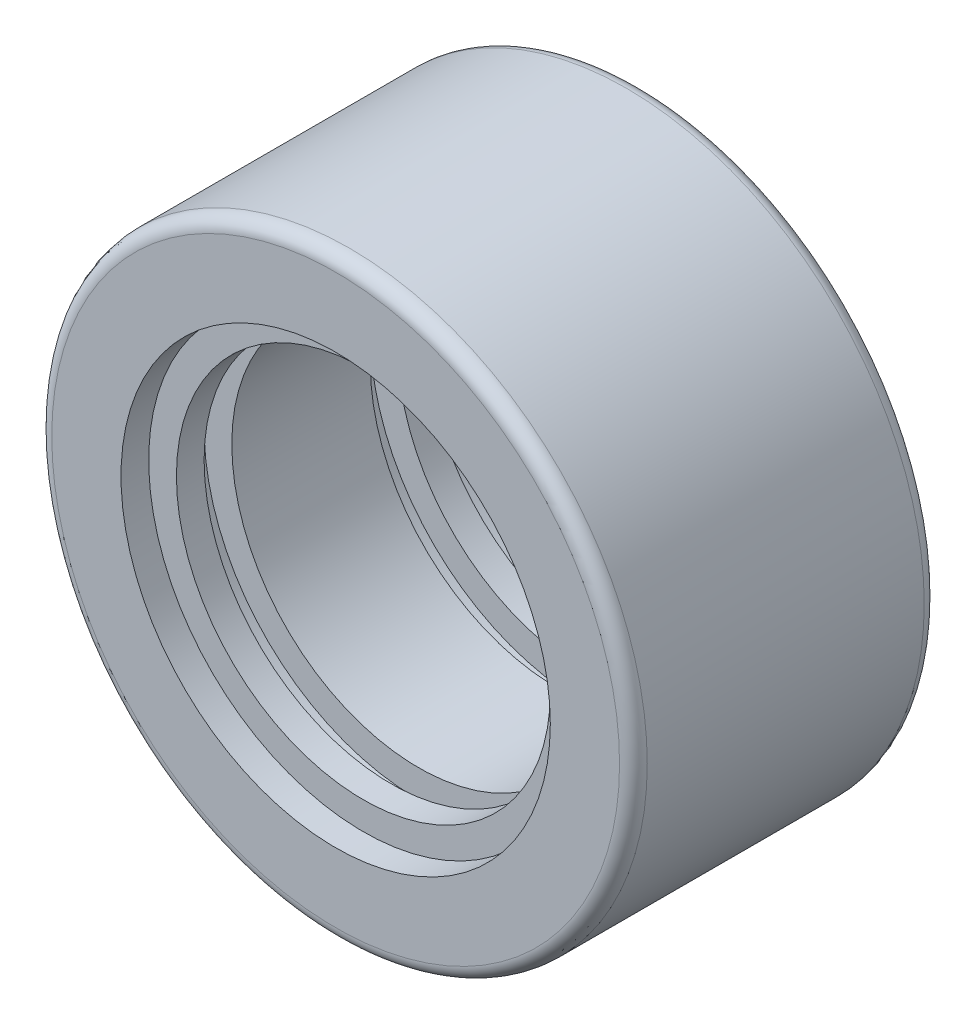
ISO-10303-21;
HEADER;
FILE_DESCRIPTION(('STEP AP214'),'2;1');
FILE_NAME('part.step','',(''),(''),'','','');
FILE_SCHEMA(('AUTOMOTIVE_DESIGN { 1 0 10303 214 1 1 1 1 }'));
ENDSEC;
DATA;
#1=APPLICATION_CONTEXT('core data for automotive mechanical design processes');
#2=APPLICATION_PROTOCOL_DEFINITION('international standard','automotive_design',2000,#1);
#3=PRODUCT_CONTEXT('',#1,'mechanical');
#4=PRODUCT('Part','Part','',(#3));
#5=PRODUCT_RELATED_PRODUCT_CATEGORY('part','',(#4));
#6=PRODUCT_DEFINITION_FORMATION('','',#4);
#7=PRODUCT_DEFINITION_CONTEXT('part definition',#1,'design');
#8=PRODUCT_DEFINITION('design','',#6,#7);
#9=PRODUCT_DEFINITION_SHAPE('','',#8);
#10=(LENGTH_UNIT() NAMED_UNIT(*) SI_UNIT(.MILLI.,.METRE.));
#11=(NAMED_UNIT(*) PLANE_ANGLE_UNIT() SI_UNIT($,.RADIAN.));
#12=(NAMED_UNIT(*) SI_UNIT($,.STERADIAN.) SOLID_ANGLE_UNIT());
#13=UNCERTAINTY_MEASURE_WITH_UNIT(LENGTH_MEASURE(1.E-05),#10,'distance_accuracy_value','');
#14=(GEOMETRIC_REPRESENTATION_CONTEXT(3) GLOBAL_UNCERTAINTY_ASSIGNED_CONTEXT((#13)) GLOBAL_UNIT_ASSIGNED_CONTEXT((#10,
#11,#12)) REPRESENTATION_CONTEXT('',''));
#15=CARTESIAN_POINT('',(0.,0.,0.));
#16=DIRECTION('',(0.,0.,1.));
#17=DIRECTION('',(1.,0.,0.));
#18=AXIS2_PLACEMENT_3D('',#15,#16,#17);
#19=CARTESIAN_POINT('',(0.,0.,10.));
#20=DIRECTION('',(0.,0.,1.));
#21=DIRECTION('',(1.,0.,0.));
#22=AXIS2_PLACEMENT_3D('',#19,#20,#21);
#23=TOROIDAL_SURFACE('',#22,20.5,1.);
#24=CARTESIAN_POINT('',(0.,0.,10.));
#25=DIRECTION('',(0.,0.,1.));
#26=DIRECTION('',(1.,0.,0.));
#27=AXIS2_PLACEMENT_3D('',#24,#25,#26);
#28=CIRCLE('',#27,21.5);
#29=CARTESIAN_POINT('',(21.5,0.,10.));
#30=VERTEX_POINT('',#29);
#31=EDGE_CURVE('E93',#30,#30,#28,.T.);
#32=ORIENTED_EDGE('',*,*,#31,.T.);
#33=EDGE_LOOP('',(#32));
#34=FACE_BOUND('',#33,.T.);
#35=CARTESIAN_POINT('',(0.,0.,11.));
#36=DIRECTION('',(0.,0.,1.));
#37=DIRECTION('',(1.,0.,0.));
#38=AXIS2_PLACEMENT_3D('',#35,#36,#37);
#39=CIRCLE('',#38,20.5);
#40=CARTESIAN_POINT('',(20.5,0.,11.));
#41=VERTEX_POINT('',#40);
#42=EDGE_CURVE('E10',#41,#41,#39,.T.);
#43=ORIENTED_EDGE('',*,*,#42,.F.);
#44=EDGE_LOOP('',(#43));
#45=FACE_BOUND('',#44,.T.);
#46=ADVANCED_FACE('F35',(#34,#45),#23,.T.);
#47=CARTESIAN_POINT('',(0.,0.,11.));
#48=DIRECTION('',(0.,0.,-1.));
#49=DIRECTION('',(-1.,0.,0.));
#50=AXIS2_PLACEMENT_3D('',#47,#48,#49);
#51=PLANE('',#50);
#52=CARTESIAN_POINT('',(0.,0.,11.));
#53=DIRECTION('',(0.,0.,1.));
#54=DIRECTION('',(1.,0.,0.));
#55=AXIS2_PLACEMENT_3D('',#52,#53,#54);
#56=CIRCLE('',#55,15.5);
#57=CARTESIAN_POINT('',(15.5,0.,11.));
#58=VERTEX_POINT('',#57);
#59=EDGE_CURVE('E41',#58,#58,#56,.T.);
#60=ORIENTED_EDGE('',*,*,#59,.F.);
#61=EDGE_LOOP('',(#60));
#62=FACE_BOUND('',#61,.T.);
#63=ORIENTED_EDGE('',*,*,#42,.T.);
#64=EDGE_LOOP('',(#63));
#65=FACE_BOUND('',#64,.T.);
#66=ADVANCED_FACE('F111',(#62,#65),#51,.F.);
#67=CARTESIAN_POINT('',(0.,0.,20.3903670385909));
#68=DIRECTION('',(0.,0.,1.));
#69=DIRECTION('',(1.,0.,0.));
#70=AXIS2_PLACEMENT_3D('',#67,#68,#69);
#71=CYLINDRICAL_SURFACE('',#70,15.5);
#72=CARTESIAN_POINT('',(0.,0.,9.));
#73=DIRECTION('',(0.,0.,1.));
#74=DIRECTION('',(1.,0.,0.));
#75=AXIS2_PLACEMENT_3D('',#72,#73,#74);
#76=CIRCLE('',#75,15.5);
#77=CARTESIAN_POINT('',(15.5,0.,9.));
#78=VERTEX_POINT('',#77);
#79=EDGE_CURVE('E45',#78,#78,#76,.T.);
#80=ORIENTED_EDGE('',*,*,#79,.F.);
#81=EDGE_LOOP('',(#80));
#82=FACE_BOUND('',#81,.T.);
#83=ORIENTED_EDGE('',*,*,#59,.T.);
#84=EDGE_LOOP('',(#83));
#85=FACE_BOUND('',#84,.T.);
#86=ADVANCED_FACE('F115',(#82,#85),#71,.F.);
#87=CARTESIAN_POINT('',(0.,0.,9.));
#88=DIRECTION('',(0.,0.,-1.));
#89=DIRECTION('',(-1.,0.,0.));
#90=AXIS2_PLACEMENT_3D('',#87,#88,#89);
#91=PLANE('',#90);
#92=CARTESIAN_POINT('',(0.,0.,9.));
#93=DIRECTION('',(0.,0.,1.));
#94=DIRECTION('',(1.,0.,0.));
#95=AXIS2_PLACEMENT_3D('',#92,#93,#94);
#96=CIRCLE('',#95,13.5);
#97=CARTESIAN_POINT('',(13.5,0.,9.));
#98=VERTEX_POINT('',#97);
#99=EDGE_CURVE('E49',#98,#98,#96,.T.);
#100=ORIENTED_EDGE('',*,*,#99,.F.);
#101=EDGE_LOOP('',(#100));
#102=FACE_BOUND('',#101,.T.);
#103=ORIENTED_EDGE('',*,*,#79,.T.);
#104=EDGE_LOOP('',(#103));
#105=FACE_BOUND('',#104,.T.);
#106=ADVANCED_FACE('F120',(#102,#105),#91,.F.);
#107=CARTESIAN_POINT('',(0.,0.,20.3903670385909));
#108=DIRECTION('',(0.,0.,1.));
#109=DIRECTION('',(1.,0.,0.));
#110=AXIS2_PLACEMENT_3D('',#107,#108,#109);
#111=CYLINDRICAL_SURFACE('',#110,13.5);
#112=CARTESIAN_POINT('',(0.,0.,7.));
#113=DIRECTION('',(0.,0.,1.));
#114=DIRECTION('',(1.,0.,0.));
#115=AXIS2_PLACEMENT_3D('',#112,#113,#114);
#116=CIRCLE('',#115,13.5);
#117=CARTESIAN_POINT('',(13.5,0.,7.));
#118=VERTEX_POINT('',#117);
#119=EDGE_CURVE('E54',#118,#118,#116,.T.);
#120=ORIENTED_EDGE('',*,*,#119,.F.);
#121=EDGE_LOOP('',(#120));
#122=FACE_BOUND('',#121,.T.);
#123=ORIENTED_EDGE('',*,*,#99,.T.);
#124=EDGE_LOOP('',(#123));
#125=FACE_BOUND('',#124,.T.);
#126=ADVANCED_FACE('F126',(#122,#125),#111,.F.);
#127=CARTESIAN_POINT('',(0.,0.,7.));
#128=DIRECTION('',(0.,0.,1.));
#129=DIRECTION('',(1.,0.,0.));
#130=AXIS2_PLACEMENT_3D('',#127,#128,#129);
#131=PLANE('',#130);
#132=CARTESIAN_POINT('',(0.,0.,7.));
#133=DIRECTION('',(0.,0.,1.));
#134=DIRECTION('',(1.,0.,0.));
#135=AXIS2_PLACEMENT_3D('',#132,#133,#134);
#136=CIRCLE('',#135,15.5);
#137=CARTESIAN_POINT('',(15.5,0.,7.));
#138=VERTEX_POINT('',#137);
#139=EDGE_CURVE('E57',#138,#138,#136,.T.);
#140=ORIENTED_EDGE('',*,*,#139,.F.);
#141=EDGE_LOOP('',(#140));
#142=FACE_BOUND('',#141,.T.);
#143=ORIENTED_EDGE('',*,*,#119,.T.);
#144=EDGE_LOOP('',(#143));
#145=FACE_BOUND('',#144,.T.);
#146=ADVANCED_FACE('F130',(#142,#145),#131,.F.);
#147=CARTESIAN_POINT('',(0.,0.,20.3903670385909));
#148=DIRECTION('',(0.,0.,1.));
#149=DIRECTION('',(1.,0.,0.));
#150=AXIS2_PLACEMENT_3D('',#147,#148,#149);
#151=CYLINDRICAL_SURFACE('',#150,15.5);
#152=CARTESIAN_POINT('',(0.,0.,5.));
#153=DIRECTION('',(0.,0.,1.));
#154=DIRECTION('',(1.,0.,0.));
#155=AXIS2_PLACEMENT_3D('',#152,#153,#154);
#156=CIRCLE('',#155,15.5);
#157=CARTESIAN_POINT('',(15.5,0.,5.));
#158=VERTEX_POINT('',#157);
#159=EDGE_CURVE('E60',#158,#158,#156,.T.);
#160=ORIENTED_EDGE('',*,*,#159,.F.);
#161=EDGE_LOOP('',(#160));
#162=FACE_BOUND('',#161,.T.);
#163=ORIENTED_EDGE('',*,*,#139,.T.);
#164=EDGE_LOOP('',(#163));
#165=FACE_BOUND('',#164,.T.);
#166=ADVANCED_FACE('F134',(#162,#165),#151,.F.);
#167=CARTESIAN_POINT('',(0.,0.,5.));
#168=DIRECTION('',(0.,0.,-1.));
#169=DIRECTION('',(-1.,0.,0.));
#170=AXIS2_PLACEMENT_3D('',#167,#168,#169);
#171=PLANE('',#170);
#172=CARTESIAN_POINT('',(0.,0.,5.));
#173=DIRECTION('',(0.,0.,1.));
#174=DIRECTION('',(1.,0.,0.));
#175=AXIS2_PLACEMENT_3D('',#172,#173,#174);
#176=CIRCLE('',#175,13.5);
#177=CARTESIAN_POINT('',(13.5,0.,5.));
#178=VERTEX_POINT('',#177);
#179=EDGE_CURVE('E63',#178,#178,#176,.T.);
#180=ORIENTED_EDGE('',*,*,#179,.F.);
#181=EDGE_LOOP('',(#180));
#182=FACE_BOUND('',#181,.T.);
#183=ORIENTED_EDGE('',*,*,#159,.T.);
#184=EDGE_LOOP('',(#183));
#185=FACE_BOUND('',#184,.T.);
#186=ADVANCED_FACE('F138',(#182,#185),#171,.F.);
#187=CARTESIAN_POINT('',(0.,0.,20.3903670385909));
#188=DIRECTION('',(0.,0.,1.));
#189=DIRECTION('',(1.,0.,0.));
#190=AXIS2_PLACEMENT_3D('',#187,#188,#189);
#191=CYLINDRICAL_SURFACE('',#190,13.5);
#192=ORIENTED_EDGE('',*,*,#179,.T.);
#193=EDGE_LOOP('',(#192));
#194=FACE_BOUND('',#193,.T.);
#195=CARTESIAN_POINT('',(0.,0.,-5.));
#196=DIRECTION('',(0.,0.,1.));
#197=DIRECTION('',(1.,0.,0.));
#198=AXIS2_PLACEMENT_3D('',#195,#196,#197);
#199=CIRCLE('',#198,13.5);
#200=CARTESIAN_POINT('',(13.5,0.,-5.));
#201=VERTEX_POINT('',#200);
#202=EDGE_CURVE('E66',#201,#201,#199,.T.);
#203=ORIENTED_EDGE('',*,*,#202,.F.);
#204=EDGE_LOOP('',(#203));
#205=FACE_BOUND('',#204,.T.);
#206=ADVANCED_FACE('F142',(#194,#205),#191,.F.);
#207=CARTESIAN_POINT('',(0.,0.,-5.));
#208=DIRECTION('',(0.,0.,-1.));
#209=DIRECTION('',(-1.,0.,0.));
#210=AXIS2_PLACEMENT_3D('',#207,#208,#209);
#211=PLANE('',#210);
#212=ORIENTED_EDGE('',*,*,#202,.T.);
#213=EDGE_LOOP('',(#212));
#214=FACE_BOUND('',#213,.T.);
#215=CARTESIAN_POINT('',(0.,0.,-5.));
#216=DIRECTION('',(0.,0.,1.));
#217=DIRECTION('',(1.,0.,0.));
#218=AXIS2_PLACEMENT_3D('',#215,#216,#217);
#219=CIRCLE('',#218,15.5);
#220=CARTESIAN_POINT('',(15.5,0.,-5.));
#221=VERTEX_POINT('',#220);
#222=EDGE_CURVE('E69',#221,#221,#219,.T.);
#223=ORIENTED_EDGE('',*,*,#222,.F.);
#224=EDGE_LOOP('',(#223));
#225=FACE_BOUND('',#224,.T.);
#226=ADVANCED_FACE('F146',(#214,#225),#211,.T.);
#227=CARTESIAN_POINT('',(0.,0.,20.3903670385909));
#228=DIRECTION('',(0.,0.,1.));
#229=DIRECTION('',(1.,0.,0.));
#230=AXIS2_PLACEMENT_3D('',#227,#228,#229);
#231=CYLINDRICAL_SURFACE('',#230,15.5);
#232=ORIENTED_EDGE('',*,*,#222,.T.);
#233=EDGE_LOOP('',(#232));
#234=FACE_BOUND('',#233,.T.);
#235=CARTESIAN_POINT('',(0.,0.,-7.));
#236=DIRECTION('',(0.,0.,1.));
#237=DIRECTION('',(1.,0.,0.));
#238=AXIS2_PLACEMENT_3D('',#235,#236,#237);
#239=CIRCLE('',#238,15.5);
#240=CARTESIAN_POINT('',(15.5,0.,-7.));
#241=VERTEX_POINT('',#240);
#242=EDGE_CURVE('E72',#241,#241,#239,.T.);
#243=ORIENTED_EDGE('',*,*,#242,.F.);
#244=EDGE_LOOP('',(#243));
#245=FACE_BOUND('',#244,.T.);
#246=ADVANCED_FACE('F150',(#234,#245),#231,.F.);
#247=CARTESIAN_POINT('',(0.,0.,-7.));
#248=DIRECTION('',(0.,0.,1.));
#249=DIRECTION('',(1.,0.,0.));
#250=AXIS2_PLACEMENT_3D('',#247,#248,#249);
#251=PLANE('',#250);
#252=ORIENTED_EDGE('',*,*,#242,.T.);
#253=EDGE_LOOP('',(#252));
#254=FACE_BOUND('',#253,.T.);
#255=CARTESIAN_POINT('',(0.,0.,-7.));
#256=DIRECTION('',(0.,0.,1.));
#257=DIRECTION('',(1.,0.,0.));
#258=AXIS2_PLACEMENT_3D('',#255,#256,#257);
#259=CIRCLE('',#258,13.5);
#260=CARTESIAN_POINT('',(13.5,0.,-7.));
#261=VERTEX_POINT('',#260);
#262=EDGE_CURVE('E75',#261,#261,#259,.T.);
#263=ORIENTED_EDGE('',*,*,#262,.F.);
#264=EDGE_LOOP('',(#263));
#265=FACE_BOUND('',#264,.T.);
#266=ADVANCED_FACE('F154',(#254,#265),#251,.T.);
#267=CARTESIAN_POINT('',(0.,0.,20.3903670385909));
#268=DIRECTION('',(0.,0.,1.));
#269=DIRECTION('',(1.,0.,0.));
#270=AXIS2_PLACEMENT_3D('',#267,#268,#269);
#271=CYLINDRICAL_SURFACE('',#270,13.5);
#272=ORIENTED_EDGE('',*,*,#262,.T.);
#273=EDGE_LOOP('',(#272));
#274=FACE_BOUND('',#273,.T.);
#275=CARTESIAN_POINT('',(0.,0.,-9.));
#276=DIRECTION('',(0.,0.,1.));
#277=DIRECTION('',(1.,0.,0.));
#278=AXIS2_PLACEMENT_3D('',#275,#276,#277);
#279=CIRCLE('',#278,13.5);
#280=CARTESIAN_POINT('',(13.5,0.,-9.));
#281=VERTEX_POINT('',#280);
#282=EDGE_CURVE('E78',#281,#281,#279,.T.);
#283=ORIENTED_EDGE('',*,*,#282,.F.);
#284=EDGE_LOOP('',(#283));
#285=FACE_BOUND('',#284,.T.);
#286=ADVANCED_FACE('F158',(#274,#285),#271,.F.);
#287=CARTESIAN_POINT('',(0.,0.,-9.));
#288=DIRECTION('',(0.,0.,-1.));
#289=DIRECTION('',(-1.,0.,0.));
#290=AXIS2_PLACEMENT_3D('',#287,#288,#289);
#291=PLANE('',#290);
#292=ORIENTED_EDGE('',*,*,#282,.T.);
#293=EDGE_LOOP('',(#292));
#294=FACE_BOUND('',#293,.T.);
#295=CARTESIAN_POINT('',(0.,0.,-9.));
#296=DIRECTION('',(0.,0.,1.));
#297=DIRECTION('',(1.,0.,0.));
#298=AXIS2_PLACEMENT_3D('',#295,#296,#297);
#299=CIRCLE('',#298,15.5);
#300=CARTESIAN_POINT('',(15.5,0.,-9.));
#301=VERTEX_POINT('',#300);
#302=EDGE_CURVE('E81',#301,#301,#299,.T.);
#303=ORIENTED_EDGE('',*,*,#302,.F.);
#304=EDGE_LOOP('',(#303));
#305=FACE_BOUND('',#304,.T.);
#306=ADVANCED_FACE('F162',(#294,#305),#291,.T.);
#307=CARTESIAN_POINT('',(0.,0.,20.3903670385909));
#308=DIRECTION('',(0.,0.,1.));
#309=DIRECTION('',(1.,0.,0.));
#310=AXIS2_PLACEMENT_3D('',#307,#308,#309);
#311=CYLINDRICAL_SURFACE('',#310,15.5);
#312=ORIENTED_EDGE('',*,*,#302,.T.);
#313=EDGE_LOOP('',(#312));
#314=FACE_BOUND('',#313,.T.);
#315=CARTESIAN_POINT('',(0.,0.,-11.));
#316=DIRECTION('',(0.,0.,1.));
#317=DIRECTION('',(1.,0.,0.));
#318=AXIS2_PLACEMENT_3D('',#315,#316,#317);
#319=CIRCLE('',#318,15.5);
#320=CARTESIAN_POINT('',(15.5,0.,-11.));
#321=VERTEX_POINT('',#320);
#322=EDGE_CURVE('E84',#321,#321,#319,.T.);
#323=ORIENTED_EDGE('',*,*,#322,.F.);
#324=EDGE_LOOP('',(#323));
#325=FACE_BOUND('',#324,.T.);
#326=ADVANCED_FACE('F166',(#314,#325),#311,.F.);
#327=CARTESIAN_POINT('',(0.,0.,-11.));
#328=DIRECTION('',(0.,0.,-1.));
#329=DIRECTION('',(-1.,0.,0.));
#330=AXIS2_PLACEMENT_3D('',#327,#328,#329);
#331=PLANE('',#330);
#332=ORIENTED_EDGE('',*,*,#322,.T.);
#333=EDGE_LOOP('',(#332));
#334=FACE_BOUND('',#333,.T.);
#335=CARTESIAN_POINT('',(0.,0.,-11.));
#336=DIRECTION('',(0.,0.,1.));
#337=DIRECTION('',(1.,0.,0.));
#338=AXIS2_PLACEMENT_3D('',#335,#336,#337);
#339=CIRCLE('',#338,20.5);
#340=CARTESIAN_POINT('',(20.5,0.,-11.));
#341=VERTEX_POINT('',#340);
#342=EDGE_CURVE('E87',#341,#341,#339,.T.);
#343=ORIENTED_EDGE('',*,*,#342,.F.);
#344=EDGE_LOOP('',(#343));
#345=FACE_BOUND('',#344,.T.);
#346=ADVANCED_FACE('F107',(#334,#345),#331,.T.);
#347=CARTESIAN_POINT('',(0.,0.,-10.));
#348=DIRECTION('',(0.,0.,1.));
#349=DIRECTION('',(1.,0.,0.));
#350=AXIS2_PLACEMENT_3D('',#347,#348,#349);
#351=TOROIDAL_SURFACE('',#350,20.5,1.);
#352=ORIENTED_EDGE('',*,*,#342,.T.);
#353=EDGE_LOOP('',(#352));
#354=FACE_BOUND('',#353,.T.);
#355=CARTESIAN_POINT('',(0.,0.,-10.));
#356=DIRECTION('',(0.,0.,1.));
#357=DIRECTION('',(1.,0.,0.));
#358=AXIS2_PLACEMENT_3D('',#355,#356,#357);
#359=CIRCLE('',#358,21.5);
#360=CARTESIAN_POINT('',(21.5,0.,-10.));
#361=VERTEX_POINT('',#360);
#362=EDGE_CURVE('E90',#361,#361,#359,.T.);
#363=ORIENTED_EDGE('',*,*,#362,.F.);
#364=EDGE_LOOP('',(#363));
#365=FACE_BOUND('',#364,.T.);
#366=ADVANCED_FACE('F101',(#354,#365),#351,.T.);
#367=CARTESIAN_POINT('',(0.,0.,20.3903670385909));
#368=DIRECTION('',(0.,0.,1.));
#369=DIRECTION('',(1.,0.,0.));
#370=AXIS2_PLACEMENT_3D('',#367,#368,#369);
#371=CYLINDRICAL_SURFACE('',#370,21.5);
#372=ORIENTED_EDGE('',*,*,#362,.T.);
#373=EDGE_LOOP('',(#372));
#374=FACE_BOUND('',#373,.T.);
#375=ORIENTED_EDGE('',*,*,#31,.F.);
#376=EDGE_LOOP('',(#375));
#377=FACE_BOUND('',#376,.T.);
#378=ADVANCED_FACE('F99',(#374,#377),#371,.T.);
#379=CLOSED_SHELL('',(#46,#66,#86,#106,#126,#146,#166,#186,#206,#226,#246,#266,#286,#306,#326,
#346,#366,#378));
#380=MANIFOLD_SOLID_BREP('B2',#379);
#381=ADVANCED_BREP_SHAPE_REPRESENTATION('',(#18,#380),#14);
#382=SHAPE_DEFINITION_REPRESENTATION(#9,#381);
ENDSEC;
END-ISO-10303-21;
